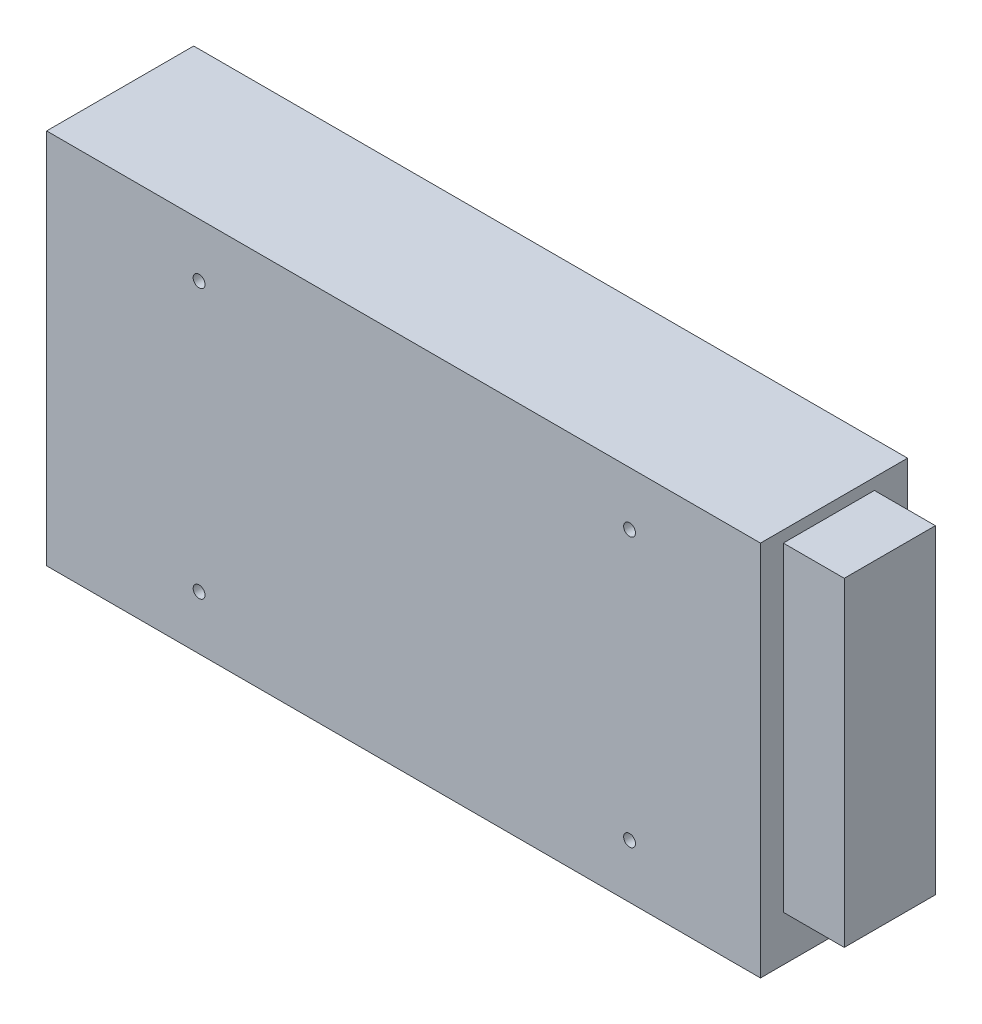
ISO-10303-21;
HEADER;
FILE_DESCRIPTION(('STEP AP214'),'2;1');
FILE_NAME('part.step','',(''),(''),'','','');
FILE_SCHEMA(('AUTOMOTIVE_DESIGN { 1 0 10303 214 1 1 1 1 }'));
ENDSEC;
DATA;
#1=APPLICATION_CONTEXT('core data for automotive mechanical design processes');
#2=APPLICATION_PROTOCOL_DEFINITION('international standard','automotive_design',2000,#1);
#3=PRODUCT_CONTEXT('',#1,'mechanical');
#4=PRODUCT('Part','Part','',(#3));
#5=PRODUCT_RELATED_PRODUCT_CATEGORY('part','',(#4));
#6=PRODUCT_DEFINITION_FORMATION('','',#4);
#7=PRODUCT_DEFINITION_CONTEXT('part definition',#1,'design');
#8=PRODUCT_DEFINITION('design','',#6,#7);
#9=PRODUCT_DEFINITION_SHAPE('','',#8);
#10=(LENGTH_UNIT() NAMED_UNIT(*) SI_UNIT(.MILLI.,.METRE.));
#11=(NAMED_UNIT(*) PLANE_ANGLE_UNIT() SI_UNIT($,.RADIAN.));
#12=(NAMED_UNIT(*) SI_UNIT($,.STERADIAN.) SOLID_ANGLE_UNIT());
#13=UNCERTAINTY_MEASURE_WITH_UNIT(LENGTH_MEASURE(1.E-05),#10,'distance_accuracy_value','');
#14=(GEOMETRIC_REPRESENTATION_CONTEXT(3) GLOBAL_UNCERTAINTY_ASSIGNED_CONTEXT((#13)) GLOBAL_UNIT_ASSIGNED_CONTEXT((#10,
#11,#12)) REPRESENTATION_CONTEXT('',''));
#15=CARTESIAN_POINT('',(0.,0.,0.));
#16=DIRECTION('',(0.,0.,1.));
#17=DIRECTION('',(1.,0.,0.));
#18=AXIS2_PLACEMENT_3D('',#15,#16,#17);
#19=CARTESIAN_POINT('',(99.5,52.5,-20.5));
#20=DIRECTION('',(-1.,0.,0.));
#21=DIRECTION('',(0.,0.,1.));
#22=AXIS2_PLACEMENT_3D('',#19,#20,#21);
#23=PLANE('',#22);
#24=DIRECTION('',(0.,0.,-1.));
#25=VECTOR('',#24,1.);
#26=CARTESIAN_POINT('',(99.5,-52.5,-20.5));
#27=LINE('',#26,#25);
#28=CARTESIAN_POINT('',(99.5,-52.5,20.5));
#29=VERTEX_POINT('',#28);
#30=CARTESIAN_POINT('',(99.5,-52.5,-20.5));
#31=VERTEX_POINT('',#30);
#32=EDGE_CURVE('E170',#29,#31,#27,.T.);
#33=ORIENTED_EDGE('',*,*,#32,.T.);
#34=DIRECTION('',(0.,-1.,0.));
#35=VECTOR('',#34,1.);
#36=CARTESIAN_POINT('',(99.5,52.5,-20.5));
#37=LINE('',#36,#35);
#38=CARTESIAN_POINT('',(99.5,52.5,-20.5));
#39=VERTEX_POINT('',#38);
#40=EDGE_CURVE('E11',#39,#31,#37,.T.);
#41=ORIENTED_EDGE('',*,*,#40,.F.);
#42=DIRECTION('',(0.,0.,-1.));
#43=VECTOR('',#42,1.);
#44=CARTESIAN_POINT('',(99.5,52.5,-20.5));
#45=LINE('',#44,#43);
#46=CARTESIAN_POINT('',(99.5,52.5,20.5));
#47=VERTEX_POINT('',#46);
#48=EDGE_CURVE('E171',#47,#39,#45,.T.);
#49=ORIENTED_EDGE('',*,*,#48,.F.);
#50=DIRECTION('',(0.,-1.,0.));
#51=VECTOR('',#50,1.);
#52=CARTESIAN_POINT('',(99.5,52.5,20.5));
#53=LINE('',#52,#51);
#54=EDGE_CURVE('E181',#47,#29,#53,.T.);
#55=ORIENTED_EDGE('',*,*,#54,.T.);
#56=EDGE_LOOP('',(#33,#41,#49,#55));
#57=FACE_BOUND('',#56,.T.);
#58=DIRECTION('',(0.,1.,0.));
#59=VECTOR('',#58,1.);
#60=CARTESIAN_POINT('',(99.5,49.325,-11.25));
#61=LINE('',#60,#59);
#62=CARTESIAN_POINT('',(99.5,-39.8,-11.25));
#63=VERTEX_POINT('',#62);
#64=CARTESIAN_POINT('',(99.5,49.325,-11.25));
#65=VERTEX_POINT('',#64);
#66=EDGE_CURVE('E142',#63,#65,#61,.T.);
#67=ORIENTED_EDGE('',*,*,#66,.F.);
#68=DIRECTION('',(0.,0.,-1.));
#69=VECTOR('',#68,1.);
#70=CARTESIAN_POINT('',(99.5,-39.8,14.1499999999999));
#71=LINE('',#70,#69);
#72=CARTESIAN_POINT('',(99.5,-39.8,14.1499999999999));
#73=VERTEX_POINT('',#72);
#74=EDGE_CURVE('E147',#73,#63,#71,.T.);
#75=ORIENTED_EDGE('',*,*,#74,.F.);
#76=DIRECTION('',(0.,-1.,0.));
#77=VECTOR('',#76,1.);
#78=CARTESIAN_POINT('',(99.5,49.325,14.1500000000001));
#79=LINE('',#78,#77);
#80=CARTESIAN_POINT('',(99.5,49.325,14.1500000000001));
#81=VERTEX_POINT('',#80);
#82=EDGE_CURVE('E56',#81,#73,#79,.T.);
#83=ORIENTED_EDGE('',*,*,#82,.F.);
#84=DIRECTION('',(0.,0.,1.));
#85=VECTOR('',#84,1.);
#86=CARTESIAN_POINT('',(99.5,49.325,14.1500000000001));
#87=LINE('',#86,#85);
#88=EDGE_CURVE('E51',#65,#81,#87,.T.);
#89=ORIENTED_EDGE('',*,*,#88,.F.);
#90=EDGE_LOOP('',(#67,#75,#83,#89));
#91=FACE_BOUND('',#90,.T.);
#92=ADVANCED_FACE('F37',(#57,#91),#23,.F.);
#93=CARTESIAN_POINT('',(-99.5,52.5,-20.5));
#94=DIRECTION('',(0.,0.,1.));
#95=DIRECTION('',(1.,0.,0.));
#96=AXIS2_PLACEMENT_3D('',#93,#94,#95);
#97=PLANE('',#96);
#98=DIRECTION('',(-1.,0.,0.));
#99=VECTOR('',#98,1.);
#100=CARTESIAN_POINT('',(-99.5,-52.5,-20.5));
#101=LINE('',#100,#99);
#102=CARTESIAN_POINT('',(-99.5,-52.5,-20.5));
#103=VERTEX_POINT('',#102);
#104=EDGE_CURVE('E184',#31,#103,#101,.T.);
#105=ORIENTED_EDGE('',*,*,#104,.T.);
#106=DIRECTION('',(0.,-1.,0.));
#107=VECTOR('',#106,1.);
#108=CARTESIAN_POINT('',(-99.5,52.5,-20.5));
#109=LINE('',#108,#107);
#110=CARTESIAN_POINT('',(-99.5,52.5,-20.5));
#111=VERTEX_POINT('',#110);
#112=EDGE_CURVE('E44',#111,#103,#109,.T.);
#113=ORIENTED_EDGE('',*,*,#112,.F.);
#114=DIRECTION('',(-1.,0.,0.));
#115=VECTOR('',#114,1.);
#116=CARTESIAN_POINT('',(-99.5,52.5,-20.5));
#117=LINE('',#116,#115);
#118=EDGE_CURVE('E174',#39,#111,#117,.T.);
#119=ORIENTED_EDGE('',*,*,#118,.F.);
#120=ORIENTED_EDGE('',*,*,#40,.T.);
#121=EDGE_LOOP('',(#105,#113,#119,#120));
#122=FACE_BOUND('',#121,.T.);
#123=ADVANCED_FACE('F214',(#122),#97,.F.);
#124=CARTESIAN_POINT('',(-99.5,52.5,-20.5));
#125=DIRECTION('',(1.,0.,0.));
#126=DIRECTION('',(0.,0.,-1.));
#127=AXIS2_PLACEMENT_3D('',#124,#125,#126);
#128=PLANE('',#127);
#129=DIRECTION('',(0.,0.,1.));
#130=VECTOR('',#129,1.);
#131=CARTESIAN_POINT('',(-99.5,-52.5,-20.5));
#132=LINE('',#131,#130);
#133=CARTESIAN_POINT('',(-99.5,-52.5,20.5));
#134=VERTEX_POINT('',#133);
#135=EDGE_CURVE('E186',#103,#134,#132,.T.);
#136=ORIENTED_EDGE('',*,*,#135,.T.);
#137=DIRECTION('',(0.,-1.,0.));
#138=VECTOR('',#137,1.);
#139=CARTESIAN_POINT('',(-99.5,52.5,20.5));
#140=LINE('',#139,#138);
#141=CARTESIAN_POINT('',(-99.5,52.5,20.5));
#142=VERTEX_POINT('',#141);
#143=EDGE_CURVE('E191',#142,#134,#140,.T.);
#144=ORIENTED_EDGE('',*,*,#143,.F.);
#145=DIRECTION('',(0.,0.,1.));
#146=VECTOR('',#145,1.);
#147=CARTESIAN_POINT('',(-99.5,52.5,-20.5));
#148=LINE('',#147,#146);
#149=EDGE_CURVE('E177',#111,#142,#148,.T.);
#150=ORIENTED_EDGE('',*,*,#149,.F.);
#151=ORIENTED_EDGE('',*,*,#112,.T.);
#152=EDGE_LOOP('',(#136,#144,#150,#151));
#153=FACE_BOUND('',#152,.T.);
#154=ADVANCED_FACE('F198',(#153),#128,.F.);
#155=CARTESIAN_POINT('',(-99.5,52.5,20.5));
#156=DIRECTION('',(0.,0.,-1.));
#157=DIRECTION('',(-1.,0.,0.));
#158=AXIS2_PLACEMENT_3D('',#155,#156,#157);
#159=PLANE('',#158);
#160=CARTESIAN_POINT('',(-57.,37.5,20.5));
#161=DIRECTION('',(0.,0.,1.));
#162=DIRECTION('',(1.,0.,0.));
#163=AXIS2_PLACEMENT_3D('',#160,#161,#162);
#164=CIRCLE('',#163,1.65);
#165=CARTESIAN_POINT('',(-55.35,37.5,20.5));
#166=VERTEX_POINT('',#165);
#167=EDGE_CURVE('E120',#166,#166,#164,.T.);
#168=ORIENTED_EDGE('',*,*,#167,.F.);
#169=EDGE_LOOP('',(#168));
#170=FACE_BOUND('',#169,.T.);
#171=CARTESIAN_POINT('',(63.,-37.5,20.5));
#172=DIRECTION('',(0.,0.,1.));
#173=DIRECTION('',(1.,0.,0.));
#174=AXIS2_PLACEMENT_3D('',#171,#172,#173);
#175=CIRCLE('',#174,1.65);
#176=CARTESIAN_POINT('',(64.65,-37.5,20.5));
#177=VERTEX_POINT('',#176);
#178=EDGE_CURVE('E119',#177,#177,#175,.T.);
#179=ORIENTED_EDGE('',*,*,#178,.F.);
#180=EDGE_LOOP('',(#179));
#181=FACE_BOUND('',#180,.T.);
#182=CARTESIAN_POINT('',(-57.,-37.5,20.5));
#183=DIRECTION('',(0.,0.,1.));
#184=DIRECTION('',(1.,0.,0.));
#185=AXIS2_PLACEMENT_3D('',#182,#183,#184);
#186=CIRCLE('',#185,1.65);
#187=CARTESIAN_POINT('',(-55.35,-37.5,20.5));
#188=VERTEX_POINT('',#187);
#189=EDGE_CURVE('E130',#188,#188,#186,.T.);
#190=ORIENTED_EDGE('',*,*,#189,.F.);
#191=EDGE_LOOP('',(#190));
#192=FACE_BOUND('',#191,.T.);
#193=CARTESIAN_POINT('',(63.,37.5,20.5));
#194=DIRECTION('',(0.,0.,1.));
#195=DIRECTION('',(1.,0.,0.));
#196=AXIS2_PLACEMENT_3D('',#193,#194,#195);
#197=CIRCLE('',#196,1.65);
#198=CARTESIAN_POINT('',(64.65,37.5,20.5));
#199=VERTEX_POINT('',#198);
#200=EDGE_CURVE('E136',#199,#199,#197,.T.);
#201=ORIENTED_EDGE('',*,*,#200,.F.);
#202=EDGE_LOOP('',(#201));
#203=FACE_BOUND('',#202,.T.);
#204=DIRECTION('',(1.,0.,0.));
#205=VECTOR('',#204,1.);
#206=CARTESIAN_POINT('',(-99.5,-52.5,20.5));
#207=LINE('',#206,#205);
#208=EDGE_CURVE('E175',#134,#29,#207,.T.);
#209=ORIENTED_EDGE('',*,*,#208,.T.);
#210=ORIENTED_EDGE('',*,*,#54,.F.);
#211=DIRECTION('',(1.,0.,0.));
#212=VECTOR('',#211,1.);
#213=CARTESIAN_POINT('',(-99.5,52.5,20.5));
#214=LINE('',#213,#212);
#215=EDGE_CURVE('E179',#142,#47,#214,.T.);
#216=ORIENTED_EDGE('',*,*,#215,.F.);
#217=ORIENTED_EDGE('',*,*,#143,.T.);
#218=EDGE_LOOP('',(#209,#210,#216,#217));
#219=FACE_BOUND('',#218,.T.);
#220=ADVANCED_FACE('F207',(#170,#181,#192,#203,#219),#159,.F.);
#221=CARTESIAN_POINT('',(0.,52.5,0.));
#222=DIRECTION('',(0.,1.,0.));
#223=DIRECTION('',(0.,0.,1.));
#224=AXIS2_PLACEMENT_3D('',#221,#222,#223);
#225=PLANE('',#224);
#226=ORIENTED_EDGE('',*,*,#48,.T.);
#227=ORIENTED_EDGE('',*,*,#118,.T.);
#228=ORIENTED_EDGE('',*,*,#149,.T.);
#229=ORIENTED_EDGE('',*,*,#215,.T.);
#230=EDGE_LOOP('',(#226,#227,#228,#229));
#231=FACE_BOUND('',#230,.T.);
#232=ADVANCED_FACE('F213',(#231),#225,.T.);
#233=CARTESIAN_POINT('',(0.,-52.5,0.));
#234=DIRECTION('',(0.,1.,0.));
#235=DIRECTION('',(0.,0.,1.));
#236=AXIS2_PLACEMENT_3D('',#233,#234,#235);
#237=PLANE('',#236);
#238=ORIENTED_EDGE('',*,*,#32,.F.);
#239=ORIENTED_EDGE('',*,*,#208,.F.);
#240=ORIENTED_EDGE('',*,*,#135,.F.);
#241=ORIENTED_EDGE('',*,*,#104,.F.);
#242=EDGE_LOOP('',(#238,#239,#240,#241));
#243=FACE_BOUND('',#242,.T.);
#244=ADVANCED_FACE('F204',(#243),#237,.F.);
#245=CARTESIAN_POINT('',(116.5,49.325,-11.25));
#246=DIRECTION('',(0.,0.,1.));
#247=DIRECTION('',(0.,-1.,0.));
#248=AXIS2_PLACEMENT_3D('',#245,#246,#247);
#249=PLANE('',#248);
#250=ORIENTED_EDGE('',*,*,#66,.T.);
#251=DIRECTION('',(-1.,0.,0.));
#252=VECTOR('',#251,1.);
#253=CARTESIAN_POINT('',(116.5,49.325,-11.25));
#254=LINE('',#253,#252);
#255=CARTESIAN_POINT('',(116.5,49.325,-11.25));
#256=VERTEX_POINT('',#255);
#257=EDGE_CURVE('E168',#256,#65,#254,.T.);
#258=ORIENTED_EDGE('',*,*,#257,.F.);
#259=DIRECTION('',(0.,1.,0.));
#260=VECTOR('',#259,1.);
#261=CARTESIAN_POINT('',(116.5,49.325,-11.25));
#262=LINE('',#261,#260);
#263=CARTESIAN_POINT('',(116.5,-39.8,-11.25));
#264=VERTEX_POINT('',#263);
#265=EDGE_CURVE('E143',#264,#256,#262,.T.);
#266=ORIENTED_EDGE('',*,*,#265,.F.);
#267=DIRECTION('',(-1.,0.,0.));
#268=VECTOR('',#267,1.);
#269=CARTESIAN_POINT('',(116.5,-39.8,-11.25));
#270=LINE('',#269,#268);
#271=EDGE_CURVE('E153',#264,#63,#270,.T.);
#272=ORIENTED_EDGE('',*,*,#271,.T.);
#273=EDGE_LOOP('',(#250,#258,#266,#272));
#274=FACE_BOUND('',#273,.T.);
#275=ADVANCED_FACE('F227',(#274),#249,.F.);
#276=CARTESIAN_POINT('',(116.5,49.325,14.1500000000001));
#277=DIRECTION('',(0.,-1.,0.));
#278=DIRECTION('',(0.,0.,-1.));
#279=AXIS2_PLACEMENT_3D('',#276,#277,#278);
#280=PLANE('',#279);
#281=ORIENTED_EDGE('',*,*,#88,.T.);
#282=DIRECTION('',(-1.,0.,0.));
#283=VECTOR('',#282,1.);
#284=CARTESIAN_POINT('',(116.5,49.325,14.1500000000001));
#285=LINE('',#284,#283);
#286=CARTESIAN_POINT('',(116.5,49.325,14.1500000000001));
#287=VERTEX_POINT('',#286);
#288=EDGE_CURVE('E165',#287,#81,#285,.T.);
#289=ORIENTED_EDGE('',*,*,#288,.F.);
#290=DIRECTION('',(0.,0.,1.));
#291=VECTOR('',#290,1.);
#292=CARTESIAN_POINT('',(116.5,49.325,14.1500000000001));
#293=LINE('',#292,#291);
#294=EDGE_CURVE('E146',#256,#287,#293,.T.);
#295=ORIENTED_EDGE('',*,*,#294,.F.);
#296=ORIENTED_EDGE('',*,*,#257,.T.);
#297=EDGE_LOOP('',(#281,#289,#295,#296));
#298=FACE_BOUND('',#297,.T.);
#299=ADVANCED_FACE('F232',(#298),#280,.F.);
#300=CARTESIAN_POINT('',(116.5,49.325,14.1500000000001));
#301=DIRECTION('',(0.,0.,-1.));
#302=DIRECTION('',(0.,1.,0.));
#303=AXIS2_PLACEMENT_3D('',#300,#301,#302);
#304=PLANE('',#303);
#305=ORIENTED_EDGE('',*,*,#82,.T.);
#306=DIRECTION('',(-1.,0.,0.));
#307=VECTOR('',#306,1.);
#308=CARTESIAN_POINT('',(116.5,-39.8,14.1499999999999));
#309=LINE('',#308,#307);
#310=CARTESIAN_POINT('',(116.5,-39.8,14.1499999999999));
#311=VERTEX_POINT('',#310);
#312=EDGE_CURVE('E162',#311,#73,#309,.T.);
#313=ORIENTED_EDGE('',*,*,#312,.F.);
#314=DIRECTION('',(0.,-1.,0.));
#315=VECTOR('',#314,1.);
#316=CARTESIAN_POINT('',(116.5,49.325,14.1500000000001));
#317=LINE('',#316,#315);
#318=EDGE_CURVE('E149',#287,#311,#317,.T.);
#319=ORIENTED_EDGE('',*,*,#318,.F.);
#320=ORIENTED_EDGE('',*,*,#288,.T.);
#321=EDGE_LOOP('',(#305,#313,#319,#320));
#322=FACE_BOUND('',#321,.T.);
#323=ADVANCED_FACE('F236',(#322),#304,.F.);
#324=CARTESIAN_POINT('',(116.5,-39.8,14.1499999999999));
#325=DIRECTION('',(0.,1.,0.));
#326=DIRECTION('',(0.,0.,1.));
#327=AXIS2_PLACEMENT_3D('',#324,#325,#326);
#328=PLANE('',#327);
#329=ORIENTED_EDGE('',*,*,#74,.T.);
#330=ORIENTED_EDGE('',*,*,#271,.F.);
#331=DIRECTION('',(0.,0.,-1.));
#332=VECTOR('',#331,1.);
#333=CARTESIAN_POINT('',(116.5,-39.8,14.1499999999999));
#334=LINE('',#333,#332);
#335=EDGE_CURVE('E151',#311,#264,#334,.T.);
#336=ORIENTED_EDGE('',*,*,#335,.F.);
#337=ORIENTED_EDGE('',*,*,#312,.T.);
#338=EDGE_LOOP('',(#329,#330,#336,#337));
#339=FACE_BOUND('',#338,.T.);
#340=ADVANCED_FACE('F240',(#339),#328,.F.);
#341=CARTESIAN_POINT('',(116.5,0.,0.));
#342=DIRECTION('',(1.,0.,0.));
#343=DIRECTION('',(0.,0.,-1.));
#344=AXIS2_PLACEMENT_3D('',#341,#342,#343);
#345=PLANE('',#344);
#346=ORIENTED_EDGE('',*,*,#265,.T.);
#347=ORIENTED_EDGE('',*,*,#294,.T.);
#348=ORIENTED_EDGE('',*,*,#318,.T.);
#349=ORIENTED_EDGE('',*,*,#335,.T.);
#350=EDGE_LOOP('',(#346,#347,#348,#349));
#351=FACE_BOUND('',#350,.T.);
#352=ADVANCED_FACE('F244',(#351),#345,.T.);
#353=CARTESIAN_POINT('',(63.,37.5,10.594));
#354=DIRECTION('',(0.,0.,1.));
#355=DIRECTION('',(1.,0.,0.));
#356=AXIS2_PLACEMENT_3D('',#353,#354,#355);
#357=CONICAL_SURFACE('',#356,1.65,1.02974425867665);
#358=CARTESIAN_POINT('',(63.,37.5,9.60257997860448));
#359=VERTEX_POINT('',#358);
#360=VERTEX_LOOP('',#359);
#361=FACE_BOUND('',#360,.T.);
#362=CARTESIAN_POINT('',(63.,37.5,10.594));
#363=DIRECTION('',(0.,0.,1.));
#364=DIRECTION('',(1.,0.,0.));
#365=AXIS2_PLACEMENT_3D('',#362,#363,#364);
#366=CIRCLE('',#365,1.65);
#367=CARTESIAN_POINT('',(64.65,37.5,10.594));
#368=VERTEX_POINT('',#367);
#369=EDGE_CURVE('E139',#368,#368,#366,.T.);
#370=ORIENTED_EDGE('',*,*,#369,.T.);
#371=EDGE_LOOP('',(#370));
#372=FACE_BOUND('',#371,.T.);
#373=ADVANCED_FACE('F248',(#361,#372),#357,.F.);
#374=CARTESIAN_POINT('',(63.,37.5,20.5));
#375=DIRECTION('',(0.,0.,1.));
#376=DIRECTION('',(1.,0.,0.));
#377=AXIS2_PLACEMENT_3D('',#374,#375,#376);
#378=CYLINDRICAL_SURFACE('',#377,1.65);
#379=ORIENTED_EDGE('',*,*,#369,.F.);
#380=EDGE_LOOP('',(#379));
#381=FACE_BOUND('',#380,.T.);
#382=ORIENTED_EDGE('',*,*,#200,.T.);
#383=EDGE_LOOP('',(#382));
#384=FACE_BOUND('',#383,.T.);
#385=ADVANCED_FACE('F252',(#381,#384),#378,.F.);
#386=CARTESIAN_POINT('',(-57.,-37.5,10.594));
#387=DIRECTION('',(0.,0.,1.));
#388=DIRECTION('',(1.,0.,0.));
#389=AXIS2_PLACEMENT_3D('',#386,#387,#388);
#390=CONICAL_SURFACE('',#389,1.65,1.02974425867665);
#391=CARTESIAN_POINT('',(-57.,-37.5,9.60257997860448));
#392=VERTEX_POINT('',#391);
#393=VERTEX_LOOP('',#392);
#394=FACE_BOUND('',#393,.T.);
#395=CARTESIAN_POINT('',(-57.,-37.5,10.594));
#396=DIRECTION('',(0.,0.,1.));
#397=DIRECTION('',(1.,0.,0.));
#398=AXIS2_PLACEMENT_3D('',#395,#396,#397);
#399=CIRCLE('',#398,1.65);
#400=CARTESIAN_POINT('',(-55.35,-37.5,10.594));
#401=VERTEX_POINT('',#400);
#402=EDGE_CURVE('E133',#401,#401,#399,.T.);
#403=ORIENTED_EDGE('',*,*,#402,.T.);
#404=EDGE_LOOP('',(#403));
#405=FACE_BOUND('',#404,.T.);
#406=ADVANCED_FACE('F256',(#394,#405),#390,.F.);
#407=CARTESIAN_POINT('',(-57.,-37.5,20.5));
#408=DIRECTION('',(0.,0.,1.));
#409=DIRECTION('',(1.,0.,0.));
#410=AXIS2_PLACEMENT_3D('',#407,#408,#409);
#411=CYLINDRICAL_SURFACE('',#410,1.65);
#412=ORIENTED_EDGE('',*,*,#402,.F.);
#413=EDGE_LOOP('',(#412));
#414=FACE_BOUND('',#413,.T.);
#415=ORIENTED_EDGE('',*,*,#189,.T.);
#416=EDGE_LOOP('',(#415));
#417=FACE_BOUND('',#416,.T.);
#418=ADVANCED_FACE('F260',(#414,#417),#411,.F.);
#419=CARTESIAN_POINT('',(63.,-37.5,10.594));
#420=DIRECTION('',(0.,0.,1.));
#421=DIRECTION('',(1.,0.,0.));
#422=AXIS2_PLACEMENT_3D('',#419,#420,#421);
#423=CONICAL_SURFACE('',#422,1.65,1.02974425867665);
#424=CARTESIAN_POINT('',(63.,-37.5,9.60257997860448));
#425=VERTEX_POINT('',#424);
#426=VERTEX_LOOP('',#425);
#427=FACE_BOUND('',#426,.T.);
#428=CARTESIAN_POINT('',(63.,-37.5,10.594));
#429=DIRECTION('',(0.,0.,1.));
#430=DIRECTION('',(1.,0.,0.));
#431=AXIS2_PLACEMENT_3D('',#428,#429,#430);
#432=CIRCLE('',#431,1.65);
#433=CARTESIAN_POINT('',(64.65,-37.5,10.594));
#434=VERTEX_POINT('',#433);
#435=EDGE_CURVE('E123',#434,#434,#432,.T.);
#436=ORIENTED_EDGE('',*,*,#435,.T.);
#437=EDGE_LOOP('',(#436));
#438=FACE_BOUND('',#437,.T.);
#439=ADVANCED_FACE('F264',(#427,#438),#423,.F.);
#440=CARTESIAN_POINT('',(63.,-37.5,20.5));
#441=DIRECTION('',(0.,0.,1.));
#442=DIRECTION('',(1.,0.,0.));
#443=AXIS2_PLACEMENT_3D('',#440,#441,#442);
#444=CYLINDRICAL_SURFACE('',#443,1.65);
#445=ORIENTED_EDGE('',*,*,#435,.F.);
#446=EDGE_LOOP('',(#445));
#447=FACE_BOUND('',#446,.T.);
#448=ORIENTED_EDGE('',*,*,#178,.T.);
#449=EDGE_LOOP('',(#448));
#450=FACE_BOUND('',#449,.T.);
#451=ADVANCED_FACE('F113',(#447,#450),#444,.F.);
#452=CARTESIAN_POINT('',(-57.,37.5,10.594));
#453=DIRECTION('',(0.,0.,1.));
#454=DIRECTION('',(1.,0.,0.));
#455=AXIS2_PLACEMENT_3D('',#452,#453,#454);
#456=CONICAL_SURFACE('',#455,1.65,1.02974425867665);
#457=CARTESIAN_POINT('',(-57.,37.5,9.60257997860448));
#458=VERTEX_POINT('',#457);
#459=VERTEX_LOOP('',#458);
#460=FACE_BOUND('',#459,.T.);
#461=CARTESIAN_POINT('',(-57.,37.5,10.594));
#462=DIRECTION('',(0.,0.,1.));
#463=DIRECTION('',(1.,0.,0.));
#464=AXIS2_PLACEMENT_3D('',#461,#462,#463);
#465=CIRCLE('',#464,1.65);
#466=CARTESIAN_POINT('',(-55.35,37.5,10.594));
#467=VERTEX_POINT('',#466);
#468=EDGE_CURVE('E117',#467,#467,#465,.T.);
#469=ORIENTED_EDGE('',*,*,#468,.T.);
#470=EDGE_LOOP('',(#469));
#471=FACE_BOUND('',#470,.T.);
#472=ADVANCED_FACE('F109',(#460,#471),#456,.F.);
#473=CARTESIAN_POINT('',(-57.,37.5,20.5));
#474=DIRECTION('',(0.,0.,1.));
#475=DIRECTION('',(1.,0.,0.));
#476=AXIS2_PLACEMENT_3D('',#473,#474,#475);
#477=CYLINDRICAL_SURFACE('',#476,1.65);
#478=ORIENTED_EDGE('',*,*,#468,.F.);
#479=EDGE_LOOP('',(#478));
#480=FACE_BOUND('',#479,.T.);
#481=ORIENTED_EDGE('',*,*,#167,.T.);
#482=EDGE_LOOP('',(#481));
#483=FACE_BOUND('',#482,.T.);
#484=ADVANCED_FACE('F112',(#480,#483),#477,.F.);
#485=CLOSED_SHELL('',(#92,#123,#154,#220,#232,#244,#275,#299,#323,#340,#352,#373,#385,#406,#418,
#439,#451,#472,#484));
#486=MANIFOLD_SOLID_BREP('B2',#485);
#487=ADVANCED_BREP_SHAPE_REPRESENTATION('',(#18,#486),#14);
#488=SHAPE_DEFINITION_REPRESENTATION(#9,#487);
ENDSEC;
END-ISO-10303-21;
